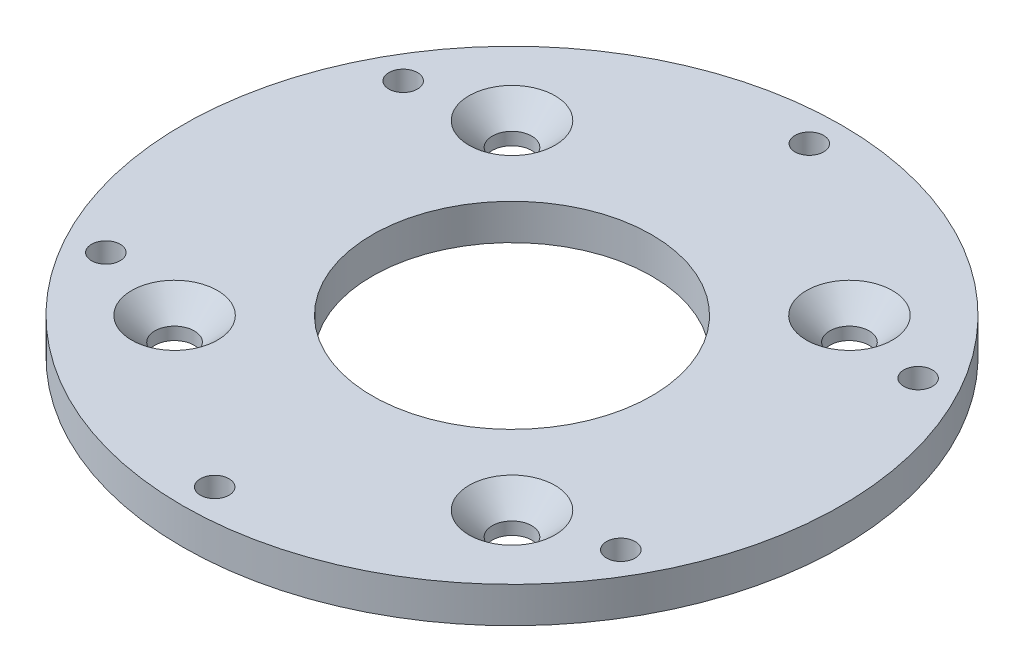
ISO-10303-21;
HEADER;
FILE_DESCRIPTION(('STEP AP214'),'2;1');
FILE_NAME('part.step','',(''),(''),'','','');
FILE_SCHEMA(('AUTOMOTIVE_DESIGN { 1 0 10303 214 1 1 1 1 }'));
ENDSEC;
DATA;
#1=APPLICATION_CONTEXT('core data for automotive mechanical design processes');
#2=APPLICATION_PROTOCOL_DEFINITION('international standard','automotive_design',2000,#1);
#3=PRODUCT_CONTEXT('',#1,'mechanical');
#4=PRODUCT('Part','Part','',(#3));
#5=PRODUCT_RELATED_PRODUCT_CATEGORY('part','',(#4));
#6=PRODUCT_DEFINITION_FORMATION('','',#4);
#7=PRODUCT_DEFINITION_CONTEXT('part definition',#1,'design');
#8=PRODUCT_DEFINITION('design','',#6,#7);
#9=PRODUCT_DEFINITION_SHAPE('','',#8);
#10=(LENGTH_UNIT() NAMED_UNIT(*) SI_UNIT(.MILLI.,.METRE.));
#11=(NAMED_UNIT(*) PLANE_ANGLE_UNIT() SI_UNIT($,.RADIAN.));
#12=(NAMED_UNIT(*) SI_UNIT($,.STERADIAN.) SOLID_ANGLE_UNIT());
#13=UNCERTAINTY_MEASURE_WITH_UNIT(LENGTH_MEASURE(1.E-05),#10,'distance_accuracy_value','');
#14=(GEOMETRIC_REPRESENTATION_CONTEXT(3) GLOBAL_UNCERTAINTY_ASSIGNED_CONTEXT((#13)) GLOBAL_UNIT_ASSIGNED_CONTEXT((#10,
#11,#12)) REPRESENTATION_CONTEXT('',''));
#15=CARTESIAN_POINT('',(0.,0.,0.));
#16=DIRECTION('',(0.,0.,1.));
#17=DIRECTION('',(1.,0.,0.));
#18=AXIS2_PLACEMENT_3D('',#15,#16,#17);
#19=CARTESIAN_POINT('',(0.,5.,0.));
#20=DIRECTION('',(0.,-1.,0.));
#21=DIRECTION('',(0.,0.,-1.));
#22=AXIS2_PLACEMENT_3D('',#19,#20,#21);
#23=CYLINDRICAL_SURFACE('',#22,46.);
#24=CARTESIAN_POINT('',(0.,5.,0.));
#25=DIRECTION('',(0.,1.,0.));
#26=DIRECTION('',(0.,0.,1.));
#27=AXIS2_PLACEMENT_3D('',#24,#25,#26);
#28=CIRCLE('',#27,46.);
#29=CARTESIAN_POINT('',(0.,5.,46.));
#30=VERTEX_POINT('',#29);
#31=EDGE_CURVE('E10',#30,#30,#28,.T.);
#32=ORIENTED_EDGE('',*,*,#31,.F.);
#33=EDGE_LOOP('',(#32));
#34=FACE_BOUND('',#33,.T.);
#35=CARTESIAN_POINT('',(0.,0.,0.));
#36=DIRECTION('',(0.,1.,0.));
#37=DIRECTION('',(0.,0.,1.));
#38=AXIS2_PLACEMENT_3D('',#35,#36,#37);
#39=CIRCLE('',#38,46.);
#40=CARTESIAN_POINT('',(0.,0.,46.));
#41=VERTEX_POINT('',#40);
#42=EDGE_CURVE('E38',#41,#41,#39,.T.);
#43=ORIENTED_EDGE('',*,*,#42,.T.);
#44=EDGE_LOOP('',(#43));
#45=FACE_BOUND('',#44,.T.);
#46=ADVANCED_FACE('F35',(#34,#45),#23,.T.);
#47=CARTESIAN_POINT('',(0.,5.,0.));
#48=DIRECTION('',(0.,1.,0.));
#49=DIRECTION('',(0.,0.,1.));
#50=AXIS2_PLACEMENT_3D('',#47,#48,#49);
#51=PLANE('',#50);
#52=CARTESIAN_POINT('',(23.55,5.,-23.55));
#53=DIRECTION('',(0.,1.,0.));
#54=DIRECTION('',(0.,0.,1.));
#55=AXIS2_PLACEMENT_3D('',#52,#53,#54);
#56=CIRCLE('',#55,6.);
#57=CARTESIAN_POINT('',(23.55,5.,-17.55));
#58=VERTEX_POINT('',#57);
#59=EDGE_CURVE('E121',#58,#58,#56,.T.);
#60=ORIENTED_EDGE('',*,*,#59,.F.);
#61=EDGE_LOOP('',(#60));
#62=FACE_BOUND('',#61,.T.);
#63=CARTESIAN_POINT('',(23.55,5.,23.55));
#64=DIRECTION('',(0.,1.,0.));
#65=DIRECTION('',(0.,0.,1.));
#66=AXIS2_PLACEMENT_3D('',#63,#64,#65);
#67=CIRCLE('',#66,6.);
#68=CARTESIAN_POINT('',(23.55,5.,29.55));
#69=VERTEX_POINT('',#68);
#70=EDGE_CURVE('E112',#69,#69,#67,.T.);
#71=ORIENTED_EDGE('',*,*,#70,.F.);
#72=EDGE_LOOP('',(#71));
#73=FACE_BOUND('',#72,.T.);
#74=CARTESIAN_POINT('',(-23.55,5.,23.55));
#75=DIRECTION('',(0.,1.,0.));
#76=DIRECTION('',(0.,0.,1.));
#77=AXIS2_PLACEMENT_3D('',#74,#75,#76);
#78=CIRCLE('',#77,6.);
#79=CARTESIAN_POINT('',(-23.55,5.,29.55));
#80=VERTEX_POINT('',#79);
#81=EDGE_CURVE('E103',#80,#80,#78,.T.);
#82=ORIENTED_EDGE('',*,*,#81,.F.);
#83=EDGE_LOOP('',(#82));
#84=FACE_BOUND('',#83,.T.);
#85=CARTESIAN_POINT('',(-23.55,5.,-23.55));
#86=DIRECTION('',(0.,1.,0.));
#87=DIRECTION('',(0.,0.,1.));
#88=AXIS2_PLACEMENT_3D('',#85,#86,#87);
#89=CIRCLE('',#88,6.);
#90=CARTESIAN_POINT('',(-23.55,5.,-17.55));
#91=VERTEX_POINT('',#90);
#92=EDGE_CURVE('E94',#91,#91,#89,.T.);
#93=ORIENTED_EDGE('',*,*,#92,.F.);
#94=EDGE_LOOP('',(#93));
#95=FACE_BOUND('',#94,.T.);
#96=CARTESIAN_POINT('',(0.,5.,0.));
#97=DIRECTION('',(0.,-1.,0.));
#98=DIRECTION('',(0.,0.,-1.));
#99=AXIS2_PLACEMENT_3D('',#96,#97,#98);
#100=CIRCLE('',#99,19.5);
#101=CARTESIAN_POINT('',(0.,5.,-19.5));
#102=VERTEX_POINT('',#101);
#103=EDGE_CURVE('E76',#102,#102,#100,.T.);
#104=ORIENTED_EDGE('',*,*,#103,.T.);
#105=EDGE_LOOP('',(#104));
#106=FACE_BOUND('',#105,.T.);
#107=CARTESIAN_POINT('',(0.,5.,41.5));
#108=DIRECTION('',(0.,-1.,0.));
#109=DIRECTION('',(0.,0.,-1.));
#110=AXIS2_PLACEMENT_3D('',#107,#108,#109);
#111=CIRCLE('',#110,2.);
#112=CARTESIAN_POINT('',(0.,5.,39.5));
#113=VERTEX_POINT('',#112);
#114=EDGE_CURVE('E45',#113,#113,#111,.T.);
#115=ORIENTED_EDGE('',*,*,#114,.T.);
#116=EDGE_LOOP('',(#115));
#117=FACE_BOUND('',#116,.T.);
#118=CARTESIAN_POINT('',(-35.9400542570542,5.,20.75));
#119=DIRECTION('',(0.,-1.,0.));
#120=DIRECTION('',(0.,0.,-1.));
#121=AXIS2_PLACEMENT_3D('',#118,#119,#120);
#122=CIRCLE('',#121,2.);
#123=CARTESIAN_POINT('',(-35.9400542570542,5.,18.75));
#124=VERTEX_POINT('',#123);
#125=EDGE_CURVE('E51',#124,#124,#122,.T.);
#126=ORIENTED_EDGE('',*,*,#125,.T.);
#127=EDGE_LOOP('',(#126));
#128=FACE_BOUND('',#127,.T.);
#129=CARTESIAN_POINT('',(-35.9400542570542,5.,-20.75));
#130=DIRECTION('',(0.,-1.,0.));
#131=DIRECTION('',(0.,0.,-1.));
#132=AXIS2_PLACEMENT_3D('',#129,#130,#131);
#133=CIRCLE('',#132,2.);
#134=CARTESIAN_POINT('',(-35.9400542570542,5.,-22.75));
#135=VERTEX_POINT('',#134);
#136=EDGE_CURVE('E50',#135,#135,#133,.T.);
#137=ORIENTED_EDGE('',*,*,#136,.T.);
#138=EDGE_LOOP('',(#137));
#139=FACE_BOUND('',#138,.T.);
#140=CARTESIAN_POINT('',(0.,5.,-41.5));
#141=DIRECTION('',(0.,-1.,0.));
#142=DIRECTION('',(0.,0.,-1.));
#143=AXIS2_PLACEMENT_3D('',#140,#141,#142);
#144=CIRCLE('',#143,2.);
#145=CARTESIAN_POINT('',(0.,5.,-43.5));
#146=VERTEX_POINT('',#145);
#147=EDGE_CURVE('E57',#146,#146,#144,.T.);
#148=ORIENTED_EDGE('',*,*,#147,.T.);
#149=EDGE_LOOP('',(#148));
#150=FACE_BOUND('',#149,.T.);
#151=CARTESIAN_POINT('',(35.9400542570542,5.,-20.75));
#152=DIRECTION('',(0.,-1.,0.));
#153=DIRECTION('',(0.,0.,-1.));
#154=AXIS2_PLACEMENT_3D('',#151,#152,#153);
#155=CIRCLE('',#154,2.);
#156=CARTESIAN_POINT('',(35.9400542570542,5.,-22.75));
#157=VERTEX_POINT('',#156);
#158=EDGE_CURVE('E63',#157,#157,#155,.T.);
#159=ORIENTED_EDGE('',*,*,#158,.T.);
#160=EDGE_LOOP('',(#159));
#161=FACE_BOUND('',#160,.T.);
#162=CARTESIAN_POINT('',(35.9400542570542,5.,20.75));
#163=DIRECTION('',(0.,-1.,0.));
#164=DIRECTION('',(0.,0.,-1.));
#165=AXIS2_PLACEMENT_3D('',#162,#163,#164);
#166=CIRCLE('',#165,2.00000000000001);
#167=CARTESIAN_POINT('',(35.9400542570542,5.,18.75));
#168=VERTEX_POINT('',#167);
#169=EDGE_CURVE('E69',#168,#168,#166,.T.);
#170=ORIENTED_EDGE('',*,*,#169,.T.);
#171=EDGE_LOOP('',(#170));
#172=FACE_BOUND('',#171,.T.);
#173=ORIENTED_EDGE('',*,*,#31,.T.);
#174=EDGE_LOOP('',(#173));
#175=FACE_BOUND('',#174,.T.);
#176=ADVANCED_FACE('F127',(#62,#73,#84,#95,#106,#117,#128,#139,#150,#161,#172,#175),#51,.T.);
#177=CARTESIAN_POINT('',(0.,0.,0.));
#178=DIRECTION('',(0.,1.,0.));
#179=DIRECTION('',(0.,0.,1.));
#180=AXIS2_PLACEMENT_3D('',#177,#178,#179);
#181=PLANE('',#180);
#182=CARTESIAN_POINT('',(23.55,0.,-23.55));
#183=DIRECTION('',(0.,1.,0.));
#184=DIRECTION('',(0.,0.,1.));
#185=AXIS2_PLACEMENT_3D('',#182,#183,#184);
#186=CIRCLE('',#185,2.75);
#187=CARTESIAN_POINT('',(23.55,0.,-20.8));
#188=VERTEX_POINT('',#187);
#189=EDGE_CURVE('E115',#188,#188,#186,.T.);
#190=ORIENTED_EDGE('',*,*,#189,.T.);
#191=EDGE_LOOP('',(#190));
#192=FACE_BOUND('',#191,.T.);
#193=CARTESIAN_POINT('',(23.55,0.,23.55));
#194=DIRECTION('',(0.,1.,0.));
#195=DIRECTION('',(0.,0.,1.));
#196=AXIS2_PLACEMENT_3D('',#193,#194,#195);
#197=CIRCLE('',#196,2.75);
#198=CARTESIAN_POINT('',(23.55,0.,26.3));
#199=VERTEX_POINT('',#198);
#200=EDGE_CURVE('E106',#199,#199,#197,.T.);
#201=ORIENTED_EDGE('',*,*,#200,.T.);
#202=EDGE_LOOP('',(#201));
#203=FACE_BOUND('',#202,.T.);
#204=CARTESIAN_POINT('',(-23.55,0.,23.55));
#205=DIRECTION('',(0.,1.,0.));
#206=DIRECTION('',(0.,0.,1.));
#207=AXIS2_PLACEMENT_3D('',#204,#205,#206);
#208=CIRCLE('',#207,2.75);
#209=CARTESIAN_POINT('',(-23.55,0.,26.3));
#210=VERTEX_POINT('',#209);
#211=EDGE_CURVE('E97',#210,#210,#208,.T.);
#212=ORIENTED_EDGE('',*,*,#211,.T.);
#213=EDGE_LOOP('',(#212));
#214=FACE_BOUND('',#213,.T.);
#215=CARTESIAN_POINT('',(-23.55,0.,-23.55));
#216=DIRECTION('',(0.,1.,0.));
#217=DIRECTION('',(0.,0.,1.));
#218=AXIS2_PLACEMENT_3D('',#215,#216,#217);
#219=CIRCLE('',#218,2.75);
#220=CARTESIAN_POINT('',(-23.55,0.,-20.8));
#221=VERTEX_POINT('',#220);
#222=EDGE_CURVE('E86',#221,#221,#219,.T.);
#223=ORIENTED_EDGE('',*,*,#222,.T.);
#224=EDGE_LOOP('',(#223));
#225=FACE_BOUND('',#224,.T.);
#226=CARTESIAN_POINT('',(0.,0.,0.));
#227=DIRECTION('',(0.,-1.,0.));
#228=DIRECTION('',(0.,0.,-1.));
#229=AXIS2_PLACEMENT_3D('',#226,#227,#228);
#230=CIRCLE('',#229,19.5);
#231=CARTESIAN_POINT('',(0.,0.,-19.5));
#232=VERTEX_POINT('',#231);
#233=EDGE_CURVE('E83',#232,#232,#230,.T.);
#234=ORIENTED_EDGE('',*,*,#233,.F.);
#235=EDGE_LOOP('',(#234));
#236=FACE_BOUND('',#235,.T.);
#237=CARTESIAN_POINT('',(0.,0.,41.5));
#238=DIRECTION('',(0.,-1.,0.));
#239=DIRECTION('',(0.,0.,-1.));
#240=AXIS2_PLACEMENT_3D('',#237,#238,#239);
#241=CIRCLE('',#240,2.);
#242=CARTESIAN_POINT('',(0.,0.,39.5));
#243=VERTEX_POINT('',#242);
#244=EDGE_CURVE('E72',#243,#243,#241,.T.);
#245=ORIENTED_EDGE('',*,*,#244,.F.);
#246=EDGE_LOOP('',(#245));
#247=FACE_BOUND('',#246,.T.);
#248=CARTESIAN_POINT('',(-35.9400542570542,0.,20.75));
#249=DIRECTION('',(0.,-1.,0.));
#250=DIRECTION('',(0.,0.,-1.));
#251=AXIS2_PLACEMENT_3D('',#248,#249,#250);
#252=CIRCLE('',#251,2.);
#253=CARTESIAN_POINT('',(-35.9400542570542,0.,18.75));
#254=VERTEX_POINT('',#253);
#255=EDGE_CURVE('E73',#254,#254,#252,.T.);
#256=ORIENTED_EDGE('',*,*,#255,.F.);
#257=EDGE_LOOP('',(#256));
#258=FACE_BOUND('',#257,.T.);
#259=CARTESIAN_POINT('',(-35.9400542570542,0.,-20.75));
#260=DIRECTION('',(0.,-1.,0.));
#261=DIRECTION('',(0.,0.,-1.));
#262=AXIS2_PLACEMENT_3D('',#259,#260,#261);
#263=CIRCLE('',#262,2.);
#264=CARTESIAN_POINT('',(-35.9400542570542,0.,-22.75));
#265=VERTEX_POINT('',#264);
#266=EDGE_CURVE('E47',#265,#265,#263,.T.);
#267=ORIENTED_EDGE('',*,*,#266,.F.);
#268=EDGE_LOOP('',(#267));
#269=FACE_BOUND('',#268,.T.);
#270=CARTESIAN_POINT('',(0.,0.,-41.5));
#271=DIRECTION('',(0.,-1.,0.));
#272=DIRECTION('',(0.,0.,-1.));
#273=AXIS2_PLACEMENT_3D('',#270,#271,#272);
#274=CIRCLE('',#273,2.);
#275=CARTESIAN_POINT('',(0.,0.,-43.5));
#276=VERTEX_POINT('',#275);
#277=EDGE_CURVE('E54',#276,#276,#274,.T.);
#278=ORIENTED_EDGE('',*,*,#277,.F.);
#279=EDGE_LOOP('',(#278));
#280=FACE_BOUND('',#279,.T.);
#281=CARTESIAN_POINT('',(35.9400542570542,0.,-20.75));
#282=DIRECTION('',(0.,-1.,0.));
#283=DIRECTION('',(0.,0.,-1.));
#284=AXIS2_PLACEMENT_3D('',#281,#282,#283);
#285=CIRCLE('',#284,2.);
#286=CARTESIAN_POINT('',(35.9400542570542,0.,-22.75));
#287=VERTEX_POINT('',#286);
#288=EDGE_CURVE('E60',#287,#287,#285,.T.);
#289=ORIENTED_EDGE('',*,*,#288,.F.);
#290=EDGE_LOOP('',(#289));
#291=FACE_BOUND('',#290,.T.);
#292=CARTESIAN_POINT('',(35.9400542570542,0.,20.75));
#293=DIRECTION('',(0.,-1.,0.));
#294=DIRECTION('',(0.,0.,-1.));
#295=AXIS2_PLACEMENT_3D('',#292,#293,#294);
#296=CIRCLE('',#295,2.00000000000001);
#297=CARTESIAN_POINT('',(35.9400542570542,0.,18.75));
#298=VERTEX_POINT('',#297);
#299=EDGE_CURVE('E66',#298,#298,#296,.T.);
#300=ORIENTED_EDGE('',*,*,#299,.F.);
#301=EDGE_LOOP('',(#300));
#302=FACE_BOUND('',#301,.T.);
#303=ORIENTED_EDGE('',*,*,#42,.F.);
#304=EDGE_LOOP('',(#303));
#305=FACE_BOUND('',#304,.T.);
#306=ADVANCED_FACE('F130',(#192,#203,#214,#225,#236,#247,#258,#269,#280,#291,#302,#305),#181,.F.);
#307=CARTESIAN_POINT('',(35.9400542570542,5.,20.75));
#308=DIRECTION('',(0.,-1.,0.));
#309=DIRECTION('',(0.,0.,-1.));
#310=AXIS2_PLACEMENT_3D('',#307,#308,#309);
#311=CYLINDRICAL_SURFACE('',#310,2.00000000000001);
#312=ORIENTED_EDGE('',*,*,#169,.F.);
#313=EDGE_LOOP('',(#312));
#314=FACE_BOUND('',#313,.T.);
#315=ORIENTED_EDGE('',*,*,#299,.T.);
#316=EDGE_LOOP('',(#315));
#317=FACE_BOUND('',#316,.T.);
#318=ADVANCED_FACE('F152',(#314,#317),#311,.F.);
#319=CARTESIAN_POINT('',(35.9400542570542,5.,-20.75));
#320=DIRECTION('',(0.,-1.,0.));
#321=DIRECTION('',(0.,0.,-1.));
#322=AXIS2_PLACEMENT_3D('',#319,#320,#321);
#323=CYLINDRICAL_SURFACE('',#322,2.);
#324=ORIENTED_EDGE('',*,*,#158,.F.);
#325=EDGE_LOOP('',(#324));
#326=FACE_BOUND('',#325,.T.);
#327=ORIENTED_EDGE('',*,*,#288,.T.);
#328=EDGE_LOOP('',(#327));
#329=FACE_BOUND('',#328,.T.);
#330=ADVANCED_FACE('F155',(#326,#329),#323,.F.);
#331=CARTESIAN_POINT('',(0.,5.,-41.5));
#332=DIRECTION('',(0.,-1.,0.));
#333=DIRECTION('',(0.,0.,-1.));
#334=AXIS2_PLACEMENT_3D('',#331,#332,#333);
#335=CYLINDRICAL_SURFACE('',#334,2.);
#336=ORIENTED_EDGE('',*,*,#147,.F.);
#337=EDGE_LOOP('',(#336));
#338=FACE_BOUND('',#337,.T.);
#339=ORIENTED_EDGE('',*,*,#277,.T.);
#340=EDGE_LOOP('',(#339));
#341=FACE_BOUND('',#340,.T.);
#342=ADVANCED_FACE('F188',(#338,#341),#335,.F.);
#343=CARTESIAN_POINT('',(-35.9400542570542,5.,-20.75));
#344=DIRECTION('',(0.,-1.,0.));
#345=DIRECTION('',(0.,0.,-1.));
#346=AXIS2_PLACEMENT_3D('',#343,#344,#345);
#347=CYLINDRICAL_SURFACE('',#346,2.);
#348=ORIENTED_EDGE('',*,*,#136,.F.);
#349=EDGE_LOOP('',(#348));
#350=FACE_BOUND('',#349,.T.);
#351=ORIENTED_EDGE('',*,*,#266,.T.);
#352=EDGE_LOOP('',(#351));
#353=FACE_BOUND('',#352,.T.);
#354=ADVANCED_FACE('F196',(#350,#353),#347,.F.);
#355=CARTESIAN_POINT('',(-35.9400542570542,5.,20.75));
#356=DIRECTION('',(0.,-1.,0.));
#357=DIRECTION('',(0.,0.,-1.));
#358=AXIS2_PLACEMENT_3D('',#355,#356,#357);
#359=CYLINDRICAL_SURFACE('',#358,2.);
#360=ORIENTED_EDGE('',*,*,#125,.F.);
#361=EDGE_LOOP('',(#360));
#362=FACE_BOUND('',#361,.T.);
#363=ORIENTED_EDGE('',*,*,#255,.T.);
#364=EDGE_LOOP('',(#363));
#365=FACE_BOUND('',#364,.T.);
#366=ADVANCED_FACE('F204',(#362,#365),#359,.F.);
#367=CARTESIAN_POINT('',(0.,5.,41.5));
#368=DIRECTION('',(0.,-1.,0.));
#369=DIRECTION('',(0.,0.,-1.));
#370=AXIS2_PLACEMENT_3D('',#367,#368,#369);
#371=CYLINDRICAL_SURFACE('',#370,2.);
#372=ORIENTED_EDGE('',*,*,#114,.F.);
#373=EDGE_LOOP('',(#372));
#374=FACE_BOUND('',#373,.T.);
#375=ORIENTED_EDGE('',*,*,#244,.T.);
#376=EDGE_LOOP('',(#375));
#377=FACE_BOUND('',#376,.T.);
#378=ADVANCED_FACE('F212',(#374,#377),#371,.F.);
#379=CARTESIAN_POINT('',(0.,5.,0.));
#380=DIRECTION('',(0.,-1.,0.));
#381=DIRECTION('',(0.,0.,-1.));
#382=AXIS2_PLACEMENT_3D('',#379,#380,#381);
#383=CYLINDRICAL_SURFACE('',#382,19.5);
#384=ORIENTED_EDGE('',*,*,#103,.F.);
#385=EDGE_LOOP('',(#384));
#386=FACE_BOUND('',#385,.T.);
#387=ORIENTED_EDGE('',*,*,#233,.T.);
#388=EDGE_LOOP('',(#387));
#389=FACE_BOUND('',#388,.T.);
#390=ADVANCED_FACE('F220',(#386,#389),#383,.F.);
#391=CARTESIAN_POINT('',(-23.55,5.,-23.55));
#392=DIRECTION('',(0.,1.,0.));
#393=DIRECTION('',(0.,0.,1.));
#394=AXIS2_PLACEMENT_3D('',#391,#392,#393);
#395=CYLINDRICAL_SURFACE('',#394,2.75);
#396=ORIENTED_EDGE('',*,*,#222,.F.);
#397=EDGE_LOOP('',(#396));
#398=FACE_BOUND('',#397,.T.);
#399=CARTESIAN_POINT('',(-23.55,1.75,-23.55));
#400=DIRECTION('',(0.,1.,0.));
#401=DIRECTION('',(0.,0.,1.));
#402=AXIS2_PLACEMENT_3D('',#399,#400,#401);
#403=CIRCLE('',#402,2.75);
#404=CARTESIAN_POINT('',(-23.55,1.75,-20.8));
#405=VERTEX_POINT('',#404);
#406=EDGE_CURVE('E91',#405,#405,#403,.T.);
#407=ORIENTED_EDGE('',*,*,#406,.T.);
#408=EDGE_LOOP('',(#407));
#409=FACE_BOUND('',#408,.T.);
#410=ADVANCED_FACE('F227',(#398,#409),#395,.F.);
#411=CARTESIAN_POINT('',(-23.55,5.,-23.55));
#412=DIRECTION('',(0.,1.,0.));
#413=DIRECTION('',(0.,0.,1.));
#414=AXIS2_PLACEMENT_3D('',#411,#412,#413);
#415=CONICAL_SURFACE('',#414,6.,0.785398163397448);
#416=ORIENTED_EDGE('',*,*,#406,.F.);
#417=EDGE_LOOP('',(#416));
#418=FACE_BOUND('',#417,.T.);
#419=ORIENTED_EDGE('',*,*,#92,.T.);
#420=EDGE_LOOP('',(#419));
#421=FACE_BOUND('',#420,.T.);
#422=ADVANCED_FACE('F234',(#418,#421),#415,.F.);
#423=CARTESIAN_POINT('',(-23.55,5.,23.55));
#424=DIRECTION('',(0.,1.,0.));
#425=DIRECTION('',(0.,0.,1.));
#426=AXIS2_PLACEMENT_3D('',#423,#424,#425);
#427=CYLINDRICAL_SURFACE('',#426,2.75);
#428=ORIENTED_EDGE('',*,*,#211,.F.);
#429=EDGE_LOOP('',(#428));
#430=FACE_BOUND('',#429,.T.);
#431=CARTESIAN_POINT('',(-23.55,1.75,23.55));
#432=DIRECTION('',(0.,1.,0.));
#433=DIRECTION('',(0.,0.,1.));
#434=AXIS2_PLACEMENT_3D('',#431,#432,#433);
#435=CIRCLE('',#434,2.75);
#436=CARTESIAN_POINT('',(-23.55,1.75,26.3));
#437=VERTEX_POINT('',#436);
#438=EDGE_CURVE('E100',#437,#437,#435,.T.);
#439=ORIENTED_EDGE('',*,*,#438,.T.);
#440=EDGE_LOOP('',(#439));
#441=FACE_BOUND('',#440,.T.);
#442=ADVANCED_FACE('F242',(#430,#441),#427,.F.);
#443=CARTESIAN_POINT('',(-23.55,5.,23.55));
#444=DIRECTION('',(0.,1.,0.));
#445=DIRECTION('',(0.,0.,1.));
#446=AXIS2_PLACEMENT_3D('',#443,#444,#445);
#447=CONICAL_SURFACE('',#446,6.,0.785398163397448);
#448=ORIENTED_EDGE('',*,*,#438,.F.);
#449=EDGE_LOOP('',(#448));
#450=FACE_BOUND('',#449,.T.);
#451=ORIENTED_EDGE('',*,*,#81,.T.);
#452=EDGE_LOOP('',(#451));
#453=FACE_BOUND('',#452,.T.);
#454=ADVANCED_FACE('F250',(#450,#453),#447,.F.);
#455=CARTESIAN_POINT('',(23.55,5.,23.55));
#456=DIRECTION('',(0.,1.,0.));
#457=DIRECTION('',(0.,0.,1.));
#458=AXIS2_PLACEMENT_3D('',#455,#456,#457);
#459=CYLINDRICAL_SURFACE('',#458,2.75);
#460=ORIENTED_EDGE('',*,*,#200,.F.);
#461=EDGE_LOOP('',(#460));
#462=FACE_BOUND('',#461,.T.);
#463=CARTESIAN_POINT('',(23.55,1.75,23.55));
#464=DIRECTION('',(0.,1.,0.));
#465=DIRECTION('',(0.,0.,1.));
#466=AXIS2_PLACEMENT_3D('',#463,#464,#465);
#467=CIRCLE('',#466,2.75);
#468=CARTESIAN_POINT('',(23.55,1.75,26.3));
#469=VERTEX_POINT('',#468);
#470=EDGE_CURVE('E109',#469,#469,#467,.T.);
#471=ORIENTED_EDGE('',*,*,#470,.T.);
#472=EDGE_LOOP('',(#471));
#473=FACE_BOUND('',#472,.T.);
#474=ADVANCED_FACE('F258',(#462,#473),#459,.F.);
#475=CARTESIAN_POINT('',(23.55,5.,23.55));
#476=DIRECTION('',(0.,1.,0.));
#477=DIRECTION('',(0.,0.,1.));
#478=AXIS2_PLACEMENT_3D('',#475,#476,#477);
#479=CONICAL_SURFACE('',#478,6.,0.785398163397448);
#480=ORIENTED_EDGE('',*,*,#470,.F.);
#481=EDGE_LOOP('',(#480));
#482=FACE_BOUND('',#481,.T.);
#483=ORIENTED_EDGE('',*,*,#70,.T.);
#484=EDGE_LOOP('',(#483));
#485=FACE_BOUND('',#484,.T.);
#486=ADVANCED_FACE('F266',(#482,#485),#479,.F.);
#487=CARTESIAN_POINT('',(23.55,5.,-23.55));
#488=DIRECTION('',(0.,1.,0.));
#489=DIRECTION('',(0.,0.,1.));
#490=AXIS2_PLACEMENT_3D('',#487,#488,#489);
#491=CYLINDRICAL_SURFACE('',#490,2.75);
#492=ORIENTED_EDGE('',*,*,#189,.F.);
#493=EDGE_LOOP('',(#492));
#494=FACE_BOUND('',#493,.T.);
#495=CARTESIAN_POINT('',(23.55,1.75,-23.55));
#496=DIRECTION('',(0.,1.,0.));
#497=DIRECTION('',(0.,0.,1.));
#498=AXIS2_PLACEMENT_3D('',#495,#496,#497);
#499=CIRCLE('',#498,2.75);
#500=CARTESIAN_POINT('',(23.55,1.75,-20.8));
#501=VERTEX_POINT('',#500);
#502=EDGE_CURVE('E118',#501,#501,#499,.T.);
#503=ORIENTED_EDGE('',*,*,#502,.T.);
#504=EDGE_LOOP('',(#503));
#505=FACE_BOUND('',#504,.T.);
#506=ADVANCED_FACE('F274',(#494,#505),#491,.F.);
#507=CARTESIAN_POINT('',(23.55,5.,-23.55));
#508=DIRECTION('',(0.,1.,0.));
#509=DIRECTION('',(0.,0.,1.));
#510=AXIS2_PLACEMENT_3D('',#507,#508,#509);
#511=CONICAL_SURFACE('',#510,6.,0.785398163397448);
#512=ORIENTED_EDGE('',*,*,#502,.F.);
#513=EDGE_LOOP('',(#512));
#514=FACE_BOUND('',#513,.T.);
#515=ORIENTED_EDGE('',*,*,#59,.T.);
#516=EDGE_LOOP('',(#515));
#517=FACE_BOUND('',#516,.T.);
#518=ADVANCED_FACE('F125',(#514,#517),#511,.F.);
#519=CLOSED_SHELL('',(#46,#176,#306,#318,#330,#342,#354,#366,#378,#390,#410,#422,#442,#454,#474,
#486,#506,#518));
#520=MANIFOLD_SOLID_BREP('B2',#519);
#521=ADVANCED_BREP_SHAPE_REPRESENTATION('',(#18,#520),#14);
#522=SHAPE_DEFINITION_REPRESENTATION(#9,#521);
ENDSEC;
END-ISO-10303-21;
